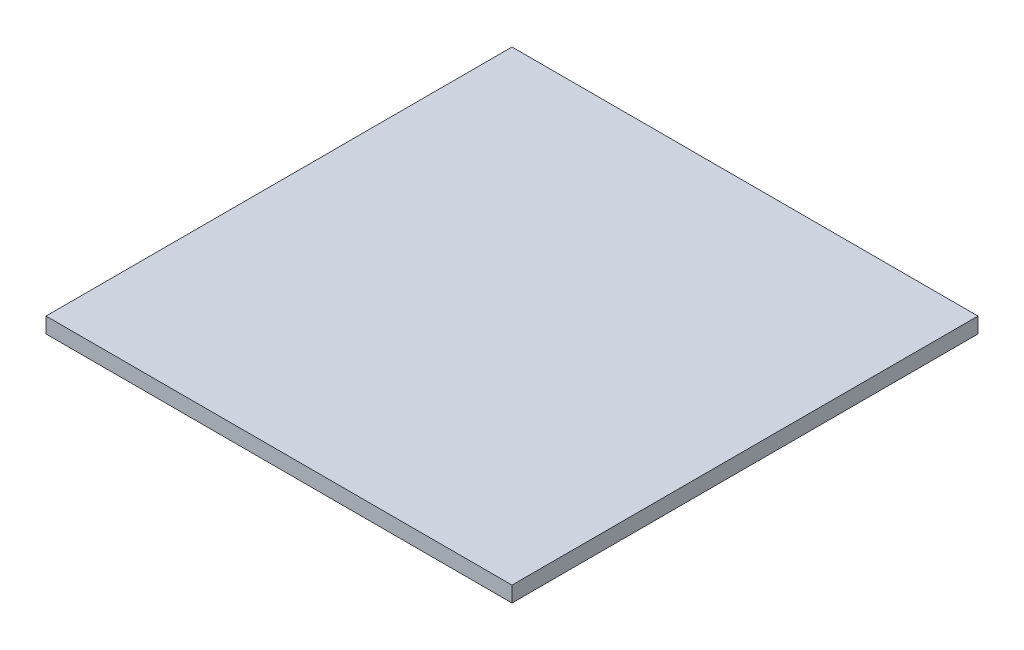
ISO-10303-21;
HEADER;
FILE_DESCRIPTION(('STEP AP214'),'2;1');
FILE_NAME('part.step','',(''),(''),'','','');
FILE_SCHEMA(('AUTOMOTIVE_DESIGN { 1 0 10303 214 1 1 1 1 }'));
ENDSEC;
DATA;
#1=APPLICATION_CONTEXT('core data for automotive mechanical design processes');
#2=APPLICATION_PROTOCOL_DEFINITION('international standard','automotive_design',2000,#1);
#3=PRODUCT_CONTEXT('',#1,'mechanical');
#4=PRODUCT('Part','Part','',(#3));
#5=PRODUCT_RELATED_PRODUCT_CATEGORY('part','',(#4));
#6=PRODUCT_DEFINITION_FORMATION('','',#4);
#7=PRODUCT_DEFINITION_CONTEXT('part definition',#1,'design');
#8=PRODUCT_DEFINITION('design','',#6,#7);
#9=PRODUCT_DEFINITION_SHAPE('','',#8);
#10=(LENGTH_UNIT() NAMED_UNIT(*) SI_UNIT(.MILLI.,.METRE.));
#11=(NAMED_UNIT(*) PLANE_ANGLE_UNIT() SI_UNIT($,.RADIAN.));
#12=(NAMED_UNIT(*) SI_UNIT($,.STERADIAN.) SOLID_ANGLE_UNIT());
#13=UNCERTAINTY_MEASURE_WITH_UNIT(LENGTH_MEASURE(1.E-05),#10,'distance_accuracy_value','');
#14=(GEOMETRIC_REPRESENTATION_CONTEXT(3) GLOBAL_UNCERTAINTY_ASSIGNED_CONTEXT((#13)) GLOBAL_UNIT_ASSIGNED_CONTEXT((#10,
#11,#12)) REPRESENTATION_CONTEXT('',''));
#15=CARTESIAN_POINT('',(0.,0.,0.));
#16=DIRECTION('',(0.,0.,1.));
#17=DIRECTION('',(1.,0.,0.));
#18=AXIS2_PLACEMENT_3D('',#15,#16,#17);
#19=CARTESIAN_POINT('',(75.,5.,-65.));
#20=DIRECTION('',(-1.,0.,0.));
#21=DIRECTION('',(0.,0.,1.));
#22=AXIS2_PLACEMENT_3D('',#19,#20,#21);
#23=PLANE('',#22);
#24=DIRECTION('',(0.,0.,-1.));
#25=VECTOR('',#24,1.);
#26=CARTESIAN_POINT('',(75.,0.,-65.));
#27=LINE('',#26,#25);
#28=CARTESIAN_POINT('',(75.,0.,85.));
#29=VERTEX_POINT('',#28);
#30=CARTESIAN_POINT('',(75.,0.,-65.));
#31=VERTEX_POINT('',#30);
#32=EDGE_CURVE('E95',#29,#31,#27,.T.);
#33=ORIENTED_EDGE('',*,*,#32,.T.);
#34=DIRECTION('',(0.,-1.,0.));
#35=VECTOR('',#34,1.);
#36=CARTESIAN_POINT('',(75.,5.,-65.));
#37=LINE('',#36,#35);
#38=CARTESIAN_POINT('',(75.,5.,-65.));
#39=VERTEX_POINT('',#38);
#40=EDGE_CURVE('E11',#39,#31,#37,.T.);
#41=ORIENTED_EDGE('',*,*,#40,.F.);
#42=DIRECTION('',(0.,0.,-1.));
#43=VECTOR('',#42,1.);
#44=CARTESIAN_POINT('',(75.,5.,-65.));
#45=LINE('',#44,#43);
#46=CARTESIAN_POINT('',(75.,5.,85.));
#47=VERTEX_POINT('',#46);
#48=EDGE_CURVE('E89',#47,#39,#45,.T.);
#49=ORIENTED_EDGE('',*,*,#48,.F.);
#50=DIRECTION('',(0.,1.,0.));
#51=VECTOR('',#50,1.);
#52=CARTESIAN_POINT('',(75.,5.,85.));
#53=LINE('',#52,#51);
#54=EDGE_CURVE('E100',#29,#47,#53,.T.);
#55=ORIENTED_EDGE('',*,*,#54,.F.);
#56=EDGE_LOOP('',(#33,#41,#49,#55));
#57=FACE_BOUND('',#56,.T.);
#58=ADVANCED_FACE('F39',(#57),#23,.F.);
#59=CARTESIAN_POINT('',(-75.,5.,-65.));
#60=DIRECTION('',(0.,0.,1.));
#61=DIRECTION('',(1.,0.,0.));
#62=AXIS2_PLACEMENT_3D('',#59,#60,#61);
#63=PLANE('',#62);
#64=DIRECTION('',(-1.,0.,0.));
#65=VECTOR('',#64,1.);
#66=CARTESIAN_POINT('',(-75.,0.,-65.));
#67=LINE('',#66,#65);
#68=CARTESIAN_POINT('',(-75.,0.,-65.));
#69=VERTEX_POINT('',#68);
#70=EDGE_CURVE('E67',#31,#69,#67,.T.);
#71=ORIENTED_EDGE('',*,*,#70,.T.);
#72=DIRECTION('',(0.,-1.,0.));
#73=VECTOR('',#72,1.);
#74=CARTESIAN_POINT('',(-75.,5.,-65.));
#75=LINE('',#74,#73);
#76=CARTESIAN_POINT('',(-75.,5.,-65.));
#77=VERTEX_POINT('',#76);
#78=EDGE_CURVE('E48',#77,#69,#75,.T.);
#79=ORIENTED_EDGE('',*,*,#78,.F.);
#80=DIRECTION('',(-1.,0.,0.));
#81=VECTOR('',#80,1.);
#82=CARTESIAN_POINT('',(-75.,5.,-65.));
#83=LINE('',#82,#81);
#84=EDGE_CURVE('E56',#39,#77,#83,.T.);
#85=ORIENTED_EDGE('',*,*,#84,.F.);
#86=ORIENTED_EDGE('',*,*,#40,.T.);
#87=EDGE_LOOP('',(#71,#79,#85,#86));
#88=FACE_BOUND('',#87,.T.);
#89=ADVANCED_FACE('F122',(#88),#63,.F.);
#90=CARTESIAN_POINT('',(-75.,5.,-65.));
#91=DIRECTION('',(1.,0.,0.));
#92=DIRECTION('',(0.,0.,-1.));
#93=AXIS2_PLACEMENT_3D('',#90,#91,#92);
#94=PLANE('',#93);
#95=DIRECTION('',(0.,0.,1.));
#96=VECTOR('',#95,1.);
#97=CARTESIAN_POINT('',(-75.,0.,-65.));
#98=LINE('',#97,#96);
#99=CARTESIAN_POINT('',(-75.,0.,85.));
#100=VERTEX_POINT('',#99);
#101=EDGE_CURVE('E83',#69,#100,#98,.T.);
#102=ORIENTED_EDGE('',*,*,#101,.T.);
#103=DIRECTION('',(0.,-1.,0.));
#104=VECTOR('',#103,1.);
#105=CARTESIAN_POINT('',(-75.,5.,85.));
#106=LINE('',#105,#104);
#107=CARTESIAN_POINT('',(-75.,5.,85.));
#108=VERTEX_POINT('',#107);
#109=EDGE_CURVE('E87',#108,#100,#106,.T.);
#110=ORIENTED_EDGE('',*,*,#109,.F.);
#111=DIRECTION('',(0.,0.,1.));
#112=VECTOR('',#111,1.);
#113=CARTESIAN_POINT('',(-75.,5.,-65.));
#114=LINE('',#113,#112);
#115=EDGE_CURVE('E71',#77,#108,#114,.T.);
#116=ORIENTED_EDGE('',*,*,#115,.F.);
#117=ORIENTED_EDGE('',*,*,#78,.T.);
#118=EDGE_LOOP('',(#102,#110,#116,#117));
#119=FACE_BOUND('',#118,.T.);
#120=ADVANCED_FACE('F85',(#119),#94,.F.);
#121=CARTESIAN_POINT('',(0.,5.,0.));
#122=DIRECTION('',(0.,1.,0.));
#123=DIRECTION('',(0.,0.,1.));
#124=AXIS2_PLACEMENT_3D('',#121,#122,#123);
#125=PLANE('',#124);
#126=ORIENTED_EDGE('',*,*,#48,.T.);
#127=ORIENTED_EDGE('',*,*,#84,.T.);
#128=ORIENTED_EDGE('',*,*,#115,.T.);
#129=DIRECTION('',(-1.,0.,0.));
#130=VECTOR('',#129,1.);
#131=CARTESIAN_POINT('',(-75.,5.,85.));
#132=LINE('',#131,#130);
#133=EDGE_CURVE('E103',#47,#108,#132,.T.);
#134=ORIENTED_EDGE('',*,*,#133,.F.);
#135=EDGE_LOOP('',(#126,#127,#128,#134));
#136=FACE_BOUND('',#135,.T.);
#137=ADVANCED_FACE('F125',(#136),#125,.T.);
#138=CARTESIAN_POINT('',(0.,0.,0.));
#139=DIRECTION('',(0.,1.,0.));
#140=DIRECTION('',(0.,0.,1.));
#141=AXIS2_PLACEMENT_3D('',#138,#139,#140);
#142=PLANE('',#141);
#143=ORIENTED_EDGE('',*,*,#32,.F.);
#144=DIRECTION('',(1.,0.,0.));
#145=VECTOR('',#144,1.);
#146=CARTESIAN_POINT('',(-75.,0.,85.));
#147=LINE('',#146,#145);
#148=EDGE_CURVE('E92',#100,#29,#147,.T.);
#149=ORIENTED_EDGE('',*,*,#148,.F.);
#150=ORIENTED_EDGE('',*,*,#101,.F.);
#151=ORIENTED_EDGE('',*,*,#70,.F.);
#152=EDGE_LOOP('',(#143,#149,#150,#151));
#153=FACE_BOUND('',#152,.T.);
#154=ADVANCED_FACE('F93',(#153),#142,.F.);
#155=CARTESIAN_POINT('',(0.,0.,85.));
#156=DIRECTION('',(0.,0.,1.));
#157=DIRECTION('',(1.,0.,0.));
#158=AXIS2_PLACEMENT_3D('',#155,#156,#157);
#159=PLANE('',#158);
#160=ORIENTED_EDGE('',*,*,#109,.T.);
#161=ORIENTED_EDGE('',*,*,#148,.T.);
#162=ORIENTED_EDGE('',*,*,#54,.T.);
#163=ORIENTED_EDGE('',*,*,#133,.T.);
#164=EDGE_LOOP('',(#160,#161,#162,#163));
#165=FACE_BOUND('',#164,.T.);
#166=ADVANCED_FACE('F102',(#165),#159,.T.);
#167=CLOSED_SHELL('',(#58,#89,#120,#137,#154,#166));
#168=MANIFOLD_SOLID_BREP('B2',#167);
#169=ADVANCED_BREP_SHAPE_REPRESENTATION('',(#18,#168),#14);
#170=SHAPE_DEFINITION_REPRESENTATION(#9,#169);
ENDSEC;
END-ISO-10303-21;
